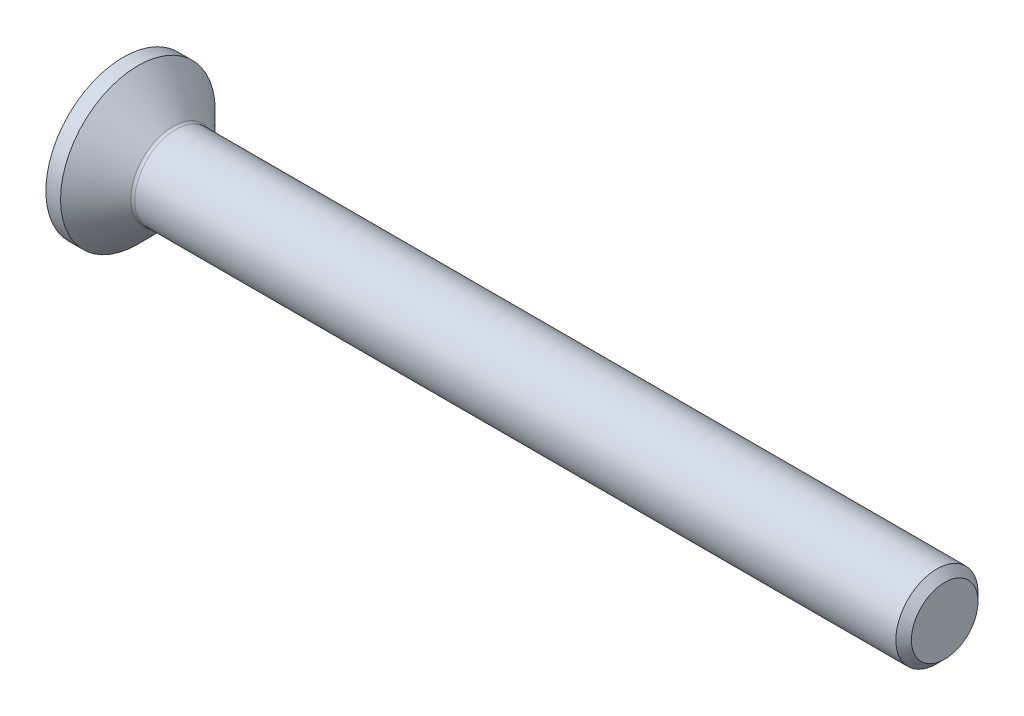
ISO-10303-21;
HEADER;
FILE_DESCRIPTION(('STEP AP214'),'2;1');
FILE_NAME('part.step','',(''),(''),'','','');
FILE_SCHEMA(('AUTOMOTIVE_DESIGN { 1 0 10303 214 1 1 1 1 }'));
ENDSEC;
DATA;
#1=APPLICATION_CONTEXT('core data for automotive mechanical design processes');
#2=APPLICATION_PROTOCOL_DEFINITION('international standard','automotive_design',2000,#1);
#3=PRODUCT_CONTEXT('',#1,'mechanical');
#4=PRODUCT('Part','Part','',(#3));
#5=PRODUCT_RELATED_PRODUCT_CATEGORY('part','',(#4));
#6=PRODUCT_DEFINITION_FORMATION('','',#4);
#7=PRODUCT_DEFINITION_CONTEXT('part definition',#1,'design');
#8=PRODUCT_DEFINITION('design','',#6,#7);
#9=PRODUCT_DEFINITION_SHAPE('','',#8);
#10=(LENGTH_UNIT() NAMED_UNIT(*) SI_UNIT(.MILLI.,.METRE.));
#11=(NAMED_UNIT(*) PLANE_ANGLE_UNIT() SI_UNIT($,.RADIAN.));
#12=(NAMED_UNIT(*) SI_UNIT($,.STERADIAN.) SOLID_ANGLE_UNIT());
#13=UNCERTAINTY_MEASURE_WITH_UNIT(LENGTH_MEASURE(1.E-05),#10,'distance_accuracy_value','');
#14=(GEOMETRIC_REPRESENTATION_CONTEXT(3) GLOBAL_UNCERTAINTY_ASSIGNED_CONTEXT((#13)) GLOBAL_UNIT_ASSIGNED_CONTEXT((#10,
#11,#12)) REPRESENTATION_CONTEXT('',''));
#15=CARTESIAN_POINT('',(0.,0.,0.));
#16=DIRECTION('',(0.,0.,1.));
#17=DIRECTION('',(1.,0.,0.));
#18=AXIS2_PLACEMENT_3D('',#15,#16,#17);
#19=CARTESIAN_POINT('',(40.,2.,0.));
#20=DIRECTION('',(-1.,0.,0.));
#21=DIRECTION('',(0.,0.,1.));
#22=AXIS2_PLACEMENT_3D('',#19,#20,#21);
#23=PLANE('',#22);
#24=CARTESIAN_POINT('',(40.,0.,0.));
#25=DIRECTION('',(-1.,0.,0.));
#26=DIRECTION('',(0.,0.,1.));
#27=AXIS2_PLACEMENT_3D('',#24,#25,#26);
#28=CIRCLE('',#27,1.62099999999999);
#29=CARTESIAN_POINT('',(40.,0.,1.62099999999999));
#30=VERTEX_POINT('',#29);
#31=EDGE_CURVE('E11',#30,#30,#28,.F.);
#32=ORIENTED_EDGE('',*,*,#31,.T.);
#33=EDGE_LOOP('',(#32));
#34=FACE_BOUND('',#33,.T.);
#35=ADVANCED_FACE('F38',(#34),#23,.F.);
#36=CARTESIAN_POINT('',(-0.587069180985524,0.,0.));
#37=DIRECTION('',(-1.,0.,0.));
#38=DIRECTION('',(0.,0.,1.));
#39=AXIS2_PLACEMENT_3D('',#36,#37,#38);
#40=CYLINDRICAL_SURFACE('',#39,2.);
#41=CARTESIAN_POINT('',(39.621,0.,0.));
#42=DIRECTION('',(-1.,0.,0.));
#43=DIRECTION('',(0.,0.,1.));
#44=AXIS2_PLACEMENT_3D('',#41,#42,#43);
#45=CIRCLE('',#44,2.);
#46=CARTESIAN_POINT('',(39.621,0.,2.));
#47=VERTEX_POINT('',#46);
#48=EDGE_CURVE('E47',#47,#47,#45,.T.);
#49=ORIENTED_EDGE('',*,*,#48,.T.);
#50=EDGE_LOOP('',(#49));
#51=FACE_BOUND('',#50,.T.);
#52=CARTESIAN_POINT('',(2.56284271247462,0.,0.));
#53=DIRECTION('',(-1.,0.,0.));
#54=DIRECTION('',(0.,0.,1.));
#55=AXIS2_PLACEMENT_3D('',#52,#53,#54);
#56=CIRCLE('',#55,2.);
#57=CARTESIAN_POINT('',(2.56284271247462,0.,2.));
#58=VERTEX_POINT('',#57);
#59=EDGE_CURVE('E151',#58,#58,#56,.F.);
#60=ORIENTED_EDGE('',*,*,#59,.T.);
#61=EDGE_LOOP('',(#60));
#62=FACE_BOUND('',#61,.T.);
#63=ADVANCED_FACE('F129',(#51,#62),#40,.T.);
#64=CARTESIAN_POINT('',(2.48,0.,0.));
#65=DIRECTION('',(-1.,0.,0.));
#66=DIRECTION('',(0.,0.,1.));
#67=AXIS2_PLACEMENT_3D('',#64,#65,#66);
#68=CONICAL_SURFACE('',#67,2.,0.785398163397448);
#69=CARTESIAN_POINT('',(0.714999999999996,0.,0.));
#70=DIRECTION('',(-1.,0.,0.));
#71=DIRECTION('',(0.,0.,1.));
#72=AXIS2_PLACEMENT_3D('',#69,#70,#71);
#73=CIRCLE('',#72,3.765);
#74=CARTESIAN_POINT('',(0.714999999999996,0.,3.765));
#75=VERTEX_POINT('',#74);
#76=EDGE_CURVE('E42',#75,#75,#73,.F.);
#77=ORIENTED_EDGE('',*,*,#76,.T.);
#78=EDGE_LOOP('',(#77));
#79=FACE_BOUND('',#78,.T.);
#80=CARTESIAN_POINT('',(2.42142135623731,0.,0.));
#81=DIRECTION('',(-1.,0.,0.));
#82=DIRECTION('',(0.,0.,1.));
#83=AXIS2_PLACEMENT_3D('',#80,#81,#82);
#84=CIRCLE('',#83,2.05857864376269);
#85=CARTESIAN_POINT('',(2.42142135623731,0.,2.05857864376269));
#86=VERTEX_POINT('',#85);
#87=EDGE_CURVE('E154',#86,#86,#84,.T.);
#88=ORIENTED_EDGE('',*,*,#87,.T.);
#89=EDGE_LOOP('',(#88));
#90=FACE_BOUND('',#89,.T.);
#91=ADVANCED_FACE('F135',(#79,#90),#68,.T.);
#92=CARTESIAN_POINT('',(2.56284271247462,0.,0.));
#93=DIRECTION('',(-1.,0.,0.));
#94=DIRECTION('',(0.,0.,1.));
#95=AXIS2_PLACEMENT_3D('',#92,#93,#94);
#96=TOROIDAL_SURFACE('',#95,2.2,0.2);
#97=ORIENTED_EDGE('',*,*,#59,.F.);
#98=EDGE_LOOP('',(#97));
#99=FACE_BOUND('',#98,.T.);
#100=ORIENTED_EDGE('',*,*,#87,.F.);
#101=EDGE_LOOP('',(#100));
#102=FACE_BOUND('',#101,.T.);
#103=ADVANCED_FACE('F139',(#99,#102),#96,.F.);
#104=CARTESIAN_POINT('',(39.621,0.,0.));
#105=DIRECTION('',(-1.,0.,0.));
#106=DIRECTION('',(0.,0.,1.));
#107=AXIS2_PLACEMENT_3D('',#104,#105,#106);
#108=CONICAL_SURFACE('',#107,2.,0.785398163397462);
#109=ORIENTED_EDGE('',*,*,#31,.F.);
#110=EDGE_LOOP('',(#109));
#111=FACE_BOUND('',#110,.T.);
#112=ORIENTED_EDGE('',*,*,#48,.F.);
#113=EDGE_LOOP('',(#112));
#114=FACE_BOUND('',#113,.T.);
#115=ADVANCED_FACE('F40',(#111,#114),#108,.T.);
#116=CARTESIAN_POINT('',(11.8531386861314,0.,0.));
#117=DIRECTION('',(1.,0.,0.));
#118=DIRECTION('',(0.,0.,-1.));
#119=AXIS2_PLACEMENT_3D('',#116,#117,#118);
#120=CYLINDRICAL_SURFACE('',#119,3.765);
#121=ORIENTED_EDGE('',*,*,#76,.F.);
#122=EDGE_LOOP('',(#121));
#123=FACE_BOUND('',#122,.T.);
#124=CARTESIAN_POINT('',(0.,0.,0.));
#125=DIRECTION('',(1.,0.,0.));
#126=DIRECTION('',(0.,0.,-1.));
#127=AXIS2_PLACEMENT_3D('',#124,#125,#126);
#128=CIRCLE('',#127,3.765);
#129=CARTESIAN_POINT('',(0.,0.,-3.765));
#130=VERTEX_POINT('',#129);
#131=EDGE_CURVE('E221',#130,#130,#128,.F.);
#132=ORIENTED_EDGE('',*,*,#131,.F.);
#133=EDGE_LOOP('',(#132));
#134=FACE_BOUND('',#133,.T.);
#135=ADVANCED_FACE('F116',(#123,#134),#120,.T.);
#136=CARTESIAN_POINT('',(2.22168783648704,0.,0.));
#137=DIRECTION('',(-1.,0.,0.));
#138=DIRECTION('',(0.,0.,1.));
#139=AXIS2_PLACEMENT_3D('',#136,#137,#138);
#140=CONICAL_SURFACE('',#139,0.,1.0471975511966);
#141=CARTESIAN_POINT('',(1.5,0.,0.));
#142=DIRECTION('',(-1.,0.,0.));
#143=DIRECTION('',(0.,0.,1.));
#144=AXIS2_PLACEMENT_3D('',#141,#142,#143);
#145=CIRCLE('',#144,1.25);
#146=CARTESIAN_POINT('',(1.5,0.625,1.08253175473055));
#147=VERTEX_POINT('',#146);
#148=CARTESIAN_POINT('',(1.5,1.25,0.));
#149=VERTEX_POINT('',#148);
#150=EDGE_CURVE('E161',#147,#149,#145,.T.);
#151=ORIENTED_EDGE('',*,*,#150,.T.);
#152=CARTESIAN_POINT('',(1.5,0.625000000000001,-1.08253175473055));
#153=VERTEX_POINT('',#152);
#154=EDGE_CURVE('E156',#149,#153,#145,.T.);
#155=ORIENTED_EDGE('',*,*,#154,.T.);
#156=CARTESIAN_POINT('',(1.5,-0.625,-1.08253175473055));
#157=VERTEX_POINT('',#156);
#158=EDGE_CURVE('E159',#153,#157,#145,.T.);
#159=ORIENTED_EDGE('',*,*,#158,.T.);
#160=CARTESIAN_POINT('',(1.5,-1.25,0.));
#161=VERTEX_POINT('',#160);
#162=EDGE_CURVE('E246',#157,#161,#145,.T.);
#163=ORIENTED_EDGE('',*,*,#162,.T.);
#164=CARTESIAN_POINT('',(1.5,-0.625,1.08253175473055));
#165=VERTEX_POINT('',#164);
#166=EDGE_CURVE('E54',#161,#165,#145,.T.);
#167=ORIENTED_EDGE('',*,*,#166,.T.);
#168=EDGE_CURVE('E170',#165,#147,#145,.T.);
#169=ORIENTED_EDGE('',*,*,#168,.T.);
#170=EDGE_LOOP('',(#151,#155,#159,#163,#167,#169));
#171=FACE_BOUND('',#170,.T.);
#172=CARTESIAN_POINT('',(2.22168783648704,0.,0.));
#173=VERTEX_POINT('',#172);
#174=VERTEX_LOOP('',#173);
#175=FACE_BOUND('',#174,.T.);
#176=ADVANCED_FACE('F113',(#171,#175),#140,.F.);
#177=CARTESIAN_POINT('',(1.5,0.,-1.44337567297406));
#178=DIRECTION('',(1.,0.,0.));
#179=DIRECTION('',(0.,0.,-1.));
#180=AXIS2_PLACEMENT_3D('',#177,#178,#179);
#181=PLANE('',#180);
#182=ORIENTED_EDGE('',*,*,#166,.F.);
#183=DIRECTION('',(0.,0.,-1.));
#184=VECTOR('',#183,1.);
#185=CARTESIAN_POINT('',(1.5,-1.25,0.721687836487032));
#186=LINE('',#185,#184);
#187=CARTESIAN_POINT('',(1.5,-1.25,0.721687836487032));
#188=VERTEX_POINT('',#187);
#189=EDGE_CURVE('E181',#188,#161,#186,.T.);
#190=ORIENTED_EDGE('',*,*,#189,.F.);
#191=DIRECTION('',(0.,-0.866025403784438,-0.5));
#192=VECTOR('',#191,1.);
#193=CARTESIAN_POINT('',(1.5,0.,1.44337567297406));
#194=LINE('',#193,#192);
#195=EDGE_CURVE('E205',#165,#188,#194,.T.);
#196=ORIENTED_EDGE('',*,*,#195,.F.);
#197=EDGE_LOOP('',(#182,#190,#196));
#198=FACE_BOUND('',#197,.T.);
#199=ADVANCED_FACE('F115',(#198),#181,.F.);
#200=ORIENTED_EDGE('',*,*,#168,.F.);
#201=CARTESIAN_POINT('',(1.5,0.,1.44337567297406));
#202=VERTEX_POINT('',#201);
#203=EDGE_CURVE('E202',#202,#165,#194,.T.);
#204=ORIENTED_EDGE('',*,*,#203,.F.);
#205=DIRECTION('',(0.,-0.866025403784439,0.5));
#206=VECTOR('',#205,1.);
#207=CARTESIAN_POINT('',(1.5,1.25,0.721687836487032));
#208=LINE('',#207,#206);
#209=EDGE_CURVE('E209',#147,#202,#208,.T.);
#210=ORIENTED_EDGE('',*,*,#209,.F.);
#211=EDGE_LOOP('',(#200,#204,#210));
#212=FACE_BOUND('',#211,.T.);
#213=ADVANCED_FACE('F122',(#212),#181,.F.);
#214=ORIENTED_EDGE('',*,*,#150,.F.);
#215=CARTESIAN_POINT('',(1.5,1.25,0.721687836487032));
#216=VERTEX_POINT('',#215);
#217=EDGE_CURVE('E206',#216,#147,#208,.T.);
#218=ORIENTED_EDGE('',*,*,#217,.F.);
#219=DIRECTION('',(0.,0.,1.));
#220=VECTOR('',#219,1.);
#221=CARTESIAN_POINT('',(1.5,1.25,-0.721687836487031));
#222=LINE('',#221,#220);
#223=EDGE_CURVE('E213',#149,#216,#222,.T.);
#224=ORIENTED_EDGE('',*,*,#223,.F.);
#225=EDGE_LOOP('',(#214,#218,#224));
#226=FACE_BOUND('',#225,.T.);
#227=ADVANCED_FACE('F277',(#226),#181,.F.);
#228=ORIENTED_EDGE('',*,*,#154,.F.);
#229=CARTESIAN_POINT('',(1.5,1.25,-0.721687836487031));
#230=VERTEX_POINT('',#229);
#231=EDGE_CURVE('E210',#230,#149,#222,.T.);
#232=ORIENTED_EDGE('',*,*,#231,.F.);
#233=DIRECTION('',(0.,0.866025403784438,0.5));
#234=VECTOR('',#233,1.);
#235=CARTESIAN_POINT('',(1.5,0.,-1.44337567297406));
#236=LINE('',#235,#234);
#237=EDGE_CURVE('E217',#153,#230,#236,.T.);
#238=ORIENTED_EDGE('',*,*,#237,.F.);
#239=EDGE_LOOP('',(#228,#232,#238));
#240=FACE_BOUND('',#239,.T.);
#241=ADVANCED_FACE('F282',(#240),#181,.F.);
#242=ORIENTED_EDGE('',*,*,#158,.F.);
#243=CARTESIAN_POINT('',(1.5,0.,-1.44337567297406));
#244=VERTEX_POINT('',#243);
#245=EDGE_CURVE('E214',#244,#153,#236,.T.);
#246=ORIENTED_EDGE('',*,*,#245,.F.);
#247=DIRECTION('',(0.,0.866025403784439,-0.5));
#248=VECTOR('',#247,1.);
#249=CARTESIAN_POINT('',(1.5,-1.25,-0.721687836487033));
#250=LINE('',#249,#248);
#251=EDGE_CURVE('E185',#157,#244,#250,.T.);
#252=ORIENTED_EDGE('',*,*,#251,.F.);
#253=EDGE_LOOP('',(#242,#246,#252));
#254=FACE_BOUND('',#253,.T.);
#255=ADVANCED_FACE('F251',(#254),#181,.F.);
#256=ORIENTED_EDGE('',*,*,#162,.F.);
#257=CARTESIAN_POINT('',(1.5,-1.25,-0.721687836487033));
#258=VERTEX_POINT('',#257);
#259=EDGE_CURVE('E218',#258,#157,#250,.T.);
#260=ORIENTED_EDGE('',*,*,#259,.F.);
#261=EDGE_CURVE('E201',#161,#258,#186,.T.);
#262=ORIENTED_EDGE('',*,*,#261,.F.);
#263=EDGE_LOOP('',(#256,#260,#262));
#264=FACE_BOUND('',#263,.T.);
#265=ADVANCED_FACE('F125',(#264),#181,.F.);
#266=CARTESIAN_POINT('',(1.5,-1.25,0.721687836487032));
#267=DIRECTION('',(0.,1.,0.));
#268=DIRECTION('',(0.,0.,1.));
#269=AXIS2_PLACEMENT_3D('',#266,#267,#268);
#270=PLANE('',#269);
#271=DIRECTION('',(0.,0.,-1.));
#272=VECTOR('',#271,1.);
#273=CARTESIAN_POINT('',(0.,-1.25,0.721687836487032));
#274=LINE('',#273,#272);
#275=CARTESIAN_POINT('',(0.,-1.25,0.721687836487032));
#276=VERTEX_POINT('',#275);
#277=CARTESIAN_POINT('',(0.,-1.25,-0.721687836487033));
#278=VERTEX_POINT('',#277);
#279=EDGE_CURVE('E182',#276,#278,#274,.T.);
#280=ORIENTED_EDGE('',*,*,#279,.F.);
#281=DIRECTION('',(-1.,0.,0.));
#282=VECTOR('',#281,1.);
#283=CARTESIAN_POINT('',(1.5,-1.25,0.721687836487032));
#284=LINE('',#283,#282);
#285=EDGE_CURVE('E177',#188,#276,#284,.T.);
#286=ORIENTED_EDGE('',*,*,#285,.F.);
#287=ORIENTED_EDGE('',*,*,#189,.T.);
#288=ORIENTED_EDGE('',*,*,#261,.T.);
#289=DIRECTION('',(-1.,0.,0.));
#290=VECTOR('',#289,1.);
#291=CARTESIAN_POINT('',(1.5,-1.25,-0.721687836487033));
#292=LINE('',#291,#290);
#293=EDGE_CURVE('E179',#258,#278,#292,.T.);
#294=ORIENTED_EDGE('',*,*,#293,.T.);
#295=EDGE_LOOP('',(#280,#286,#287,#288,#294));
#296=FACE_BOUND('',#295,.T.);
#297=ADVANCED_FACE('F240',(#296),#270,.T.);
#298=CARTESIAN_POINT('',(1.5,0.,1.44337567297406));
#299=DIRECTION('',(0.,0.5,-0.866025403784438));
#300=DIRECTION('',(0.,0.866025403784438,0.5));
#301=AXIS2_PLACEMENT_3D('',#298,#299,#300);
#302=PLANE('',#301);
#303=DIRECTION('',(0.,-0.866025403784438,-0.5));
#304=VECTOR('',#303,1.);
#305=CARTESIAN_POINT('',(0.,0.,1.44337567297406));
#306=LINE('',#305,#304);
#307=CARTESIAN_POINT('',(0.,0.,1.44337567297406));
#308=VERTEX_POINT('',#307);
#309=EDGE_CURVE('E186',#308,#276,#306,.T.);
#310=ORIENTED_EDGE('',*,*,#309,.F.);
#311=DIRECTION('',(-1.,0.,0.));
#312=VECTOR('',#311,1.);
#313=CARTESIAN_POINT('',(1.5,0.,1.44337567297406));
#314=LINE('',#313,#312);
#315=EDGE_CURVE('E175',#202,#308,#314,.T.);
#316=ORIENTED_EDGE('',*,*,#315,.F.);
#317=ORIENTED_EDGE('',*,*,#203,.T.);
#318=ORIENTED_EDGE('',*,*,#195,.T.);
#319=ORIENTED_EDGE('',*,*,#285,.T.);
#320=EDGE_LOOP('',(#310,#316,#317,#318,#319));
#321=FACE_BOUND('',#320,.T.);
#322=ADVANCED_FACE('F270',(#321),#302,.T.);
#323=CARTESIAN_POINT('',(1.5,1.25,0.721687836487032));
#324=DIRECTION('',(0.,-0.5,-0.866025403784438));
#325=DIRECTION('',(0.,0.866025403784439,-0.5));
#326=AXIS2_PLACEMENT_3D('',#323,#324,#325);
#327=PLANE('',#326);
#328=DIRECTION('',(0.,-0.866025403784439,0.5));
#329=VECTOR('',#328,1.);
#330=CARTESIAN_POINT('',(0.,1.25,0.721687836487032));
#331=LINE('',#330,#329);
#332=CARTESIAN_POINT('',(0.,1.25,0.721687836487032));
#333=VERTEX_POINT('',#332);
#334=EDGE_CURVE('E189',#333,#308,#331,.T.);
#335=ORIENTED_EDGE('',*,*,#334,.F.);
#336=DIRECTION('',(-1.,0.,0.));
#337=VECTOR('',#336,1.);
#338=CARTESIAN_POINT('',(1.5,1.25,0.721687836487032));
#339=LINE('',#338,#337);
#340=EDGE_CURVE('E173',#216,#333,#339,.T.);
#341=ORIENTED_EDGE('',*,*,#340,.F.);
#342=ORIENTED_EDGE('',*,*,#217,.T.);
#343=ORIENTED_EDGE('',*,*,#209,.T.);
#344=ORIENTED_EDGE('',*,*,#315,.T.);
#345=EDGE_LOOP('',(#335,#341,#342,#343,#344));
#346=FACE_BOUND('',#345,.T.);
#347=ADVANCED_FACE('F264',(#346),#327,.T.);
#348=CARTESIAN_POINT('',(1.5,1.25,-0.721687836487031));
#349=DIRECTION('',(0.,-1.,0.));
#350=DIRECTION('',(0.,0.,-1.));
#351=AXIS2_PLACEMENT_3D('',#348,#349,#350);
#352=PLANE('',#351);
#353=DIRECTION('',(0.,0.,1.));
#354=VECTOR('',#353,1.);
#355=CARTESIAN_POINT('',(0.,1.25,-0.721687836487031));
#356=LINE('',#355,#354);
#357=CARTESIAN_POINT('',(0.,1.25,-0.721687836487031));
#358=VERTEX_POINT('',#357);
#359=EDGE_CURVE('E192',#358,#333,#356,.T.);
#360=ORIENTED_EDGE('',*,*,#359,.F.);
#361=DIRECTION('',(-1.,0.,0.));
#362=VECTOR('',#361,1.);
#363=CARTESIAN_POINT('',(1.5,1.25,-0.721687836487031));
#364=LINE('',#363,#362);
#365=EDGE_CURVE('E171',#230,#358,#364,.T.);
#366=ORIENTED_EDGE('',*,*,#365,.F.);
#367=ORIENTED_EDGE('',*,*,#231,.T.);
#368=ORIENTED_EDGE('',*,*,#223,.T.);
#369=ORIENTED_EDGE('',*,*,#340,.T.);
#370=EDGE_LOOP('',(#360,#366,#367,#368,#369));
#371=FACE_BOUND('',#370,.T.);
#372=ADVANCED_FACE('F260',(#371),#352,.T.);
#373=CARTESIAN_POINT('',(1.5,0.,-1.44337567297406));
#374=DIRECTION('',(0.,-0.5,0.866025403784438));
#375=DIRECTION('',(0.,-0.866025403784438,-0.5));
#376=AXIS2_PLACEMENT_3D('',#373,#374,#375);
#377=PLANE('',#376);
#378=DIRECTION('',(0.,0.866025403784438,0.5));
#379=VECTOR('',#378,1.);
#380=CARTESIAN_POINT('',(0.,0.,-1.44337567297406));
#381=LINE('',#380,#379);
#382=CARTESIAN_POINT('',(0.,0.,-1.44337567297406));
#383=VERTEX_POINT('',#382);
#384=EDGE_CURVE('E195',#383,#358,#381,.T.);
#385=ORIENTED_EDGE('',*,*,#384,.F.);
#386=DIRECTION('',(-1.,0.,0.));
#387=VECTOR('',#386,1.);
#388=CARTESIAN_POINT('',(1.5,0.,-1.44337567297406));
#389=LINE('',#388,#387);
#390=EDGE_CURVE('E163',#244,#383,#389,.T.);
#391=ORIENTED_EDGE('',*,*,#390,.F.);
#392=ORIENTED_EDGE('',*,*,#245,.T.);
#393=ORIENTED_EDGE('',*,*,#237,.T.);
#394=ORIENTED_EDGE('',*,*,#365,.T.);
#395=EDGE_LOOP('',(#385,#391,#392,#393,#394));
#396=FACE_BOUND('',#395,.T.);
#397=ADVANCED_FACE('F255',(#396),#377,.T.);
#398=CARTESIAN_POINT('',(1.5,-1.25,-0.721687836487033));
#399=DIRECTION('',(0.,0.5,0.866025403784438));
#400=DIRECTION('',(0.,-0.866025403784439,0.5));
#401=AXIS2_PLACEMENT_3D('',#398,#399,#400);
#402=PLANE('',#401);
#403=DIRECTION('',(0.,0.866025403784439,-0.5));
#404=VECTOR('',#403,1.);
#405=CARTESIAN_POINT('',(0.,-1.25,-0.721687836487033));
#406=LINE('',#405,#404);
#407=EDGE_CURVE('E62',#278,#383,#406,.T.);
#408=ORIENTED_EDGE('',*,*,#407,.F.);
#409=ORIENTED_EDGE('',*,*,#293,.F.);
#410=ORIENTED_EDGE('',*,*,#259,.T.);
#411=ORIENTED_EDGE('',*,*,#251,.T.);
#412=ORIENTED_EDGE('',*,*,#390,.T.);
#413=EDGE_LOOP('',(#408,#409,#410,#411,#412));
#414=FACE_BOUND('',#413,.T.);
#415=ADVANCED_FACE('F234',(#414),#402,.T.);
#416=CARTESIAN_POINT('',(0.,0.,0.));
#417=DIRECTION('',(1.,0.,0.));
#418=DIRECTION('',(0.,0.,-1.));
#419=AXIS2_PLACEMENT_3D('',#416,#417,#418);
#420=PLANE('',#419);
#421=ORIENTED_EDGE('',*,*,#131,.T.);
#422=EDGE_LOOP('',(#421));
#423=FACE_BOUND('',#422,.T.);
#424=ORIENTED_EDGE('',*,*,#407,.T.);
#425=ORIENTED_EDGE('',*,*,#384,.T.);
#426=ORIENTED_EDGE('',*,*,#359,.T.);
#427=ORIENTED_EDGE('',*,*,#334,.T.);
#428=ORIENTED_EDGE('',*,*,#309,.T.);
#429=ORIENTED_EDGE('',*,*,#279,.T.);
#430=EDGE_LOOP('',(#424,#425,#426,#427,#428,#429));
#431=FACE_BOUND('',#430,.T.);
#432=ADVANCED_FACE('F231',(#423,#431),#420,.F.);
#433=CLOSED_SHELL('',(#35,#63,#91,#103,#115,#135,#176,#199,#213,#227,#241,#255,#265,#297,#322,
#347,#372,#397,#415,#432));
#434=MANIFOLD_SOLID_BREP('B2',#433);
#435=ADVANCED_BREP_SHAPE_REPRESENTATION('',(#18,#434),#14);
#436=SHAPE_DEFINITION_REPRESENTATION(#9,#435);
ENDSEC;
END-ISO-10303-21;
